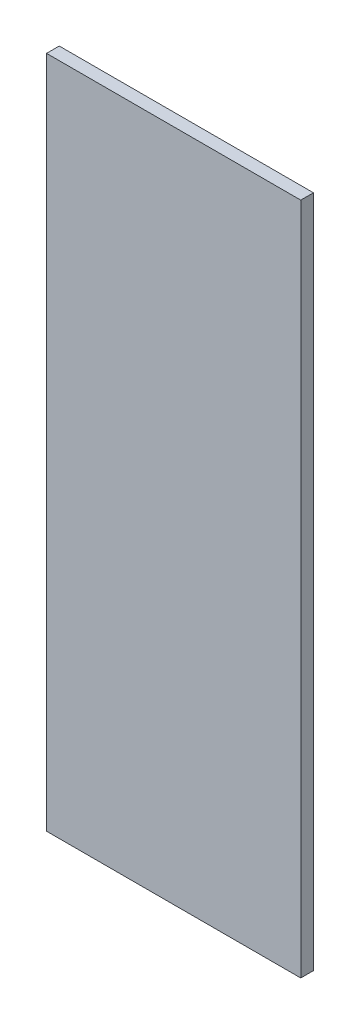
ISO-10303-21;
HEADER;
FILE_DESCRIPTION(('STEP AP214'),'2;1');
FILE_NAME('part.step','',(''),(''),'','','');
FILE_SCHEMA(('AUTOMOTIVE_DESIGN { 1 0 10303 214 1 1 1 1 }'));
ENDSEC;
DATA;
#1=APPLICATION_CONTEXT('core data for automotive mechanical design processes');
#2=APPLICATION_PROTOCOL_DEFINITION('international standard','automotive_design',2000,#1);
#3=PRODUCT_CONTEXT('',#1,'mechanical');
#4=PRODUCT('Part','Part','',(#3));
#5=PRODUCT_RELATED_PRODUCT_CATEGORY('part','',(#4));
#6=PRODUCT_DEFINITION_FORMATION('','',#4);
#7=PRODUCT_DEFINITION_CONTEXT('part definition',#1,'design');
#8=PRODUCT_DEFINITION('design','',#6,#7);
#9=PRODUCT_DEFINITION_SHAPE('','',#8);
#10=(LENGTH_UNIT() NAMED_UNIT(*) SI_UNIT(.MILLI.,.METRE.));
#11=(NAMED_UNIT(*) PLANE_ANGLE_UNIT() SI_UNIT($,.RADIAN.));
#12=(NAMED_UNIT(*) SI_UNIT($,.STERADIAN.) SOLID_ANGLE_UNIT());
#13=UNCERTAINTY_MEASURE_WITH_UNIT(LENGTH_MEASURE(1.E-05),#10,'distance_accuracy_value','');
#14=(GEOMETRIC_REPRESENTATION_CONTEXT(3) GLOBAL_UNCERTAINTY_ASSIGNED_CONTEXT((#13)) GLOBAL_UNIT_ASSIGNED_CONTEXT((#10,
#11,#12)) REPRESENTATION_CONTEXT('',''));
#15=CARTESIAN_POINT('',(0.,0.,0.));
#16=DIRECTION('',(0.,0.,1.));
#17=DIRECTION('',(1.,0.,0.));
#18=AXIS2_PLACEMENT_3D('',#15,#16,#17);
#19=CARTESIAN_POINT('',(0.,0.,4.));
#20=DIRECTION('',(1.,0.,0.));
#21=DIRECTION('',(0.,0.,-1.));
#22=AXIS2_PLACEMENT_3D('',#19,#20,#21);
#23=PLANE('',#22);
#24=DIRECTION('',(0.,-1.,0.));
#25=VECTOR('',#24,1.);
#26=CARTESIAN_POINT('',(0.,0.,0.));
#27=LINE('',#26,#25);
#28=CARTESIAN_POINT('',(0.,212.,0.));
#29=VERTEX_POINT('',#28);
#30=CARTESIAN_POINT('',(0.,0.,0.));
#31=VERTEX_POINT('',#30);
#32=EDGE_CURVE('E113',#29,#31,#27,.T.);
#33=ORIENTED_EDGE('',*,*,#32,.T.);
#34=DIRECTION('',(0.,0.,-1.));
#35=VECTOR('',#34,1.);
#36=CARTESIAN_POINT('',(0.,0.,4.));
#37=LINE('',#36,#35);
#38=CARTESIAN_POINT('',(0.,0.,4.));
#39=VERTEX_POINT('',#38);
#40=EDGE_CURVE('E11',#39,#31,#37,.T.);
#41=ORIENTED_EDGE('',*,*,#40,.F.);
#42=DIRECTION('',(0.,-1.,0.));
#43=VECTOR('',#42,1.);
#44=CARTESIAN_POINT('',(0.,0.,4.));
#45=LINE('',#44,#43);
#46=CARTESIAN_POINT('',(0.,212.,4.));
#47=VERTEX_POINT('',#46);
#48=EDGE_CURVE('E97',#47,#39,#45,.T.);
#49=ORIENTED_EDGE('',*,*,#48,.F.);
#50=DIRECTION('',(0.,0.,-1.));
#51=VECTOR('',#50,1.);
#52=CARTESIAN_POINT('',(0.,212.,4.));
#53=LINE('',#52,#51);
#54=EDGE_CURVE('E109',#47,#29,#53,.T.);
#55=ORIENTED_EDGE('',*,*,#54,.T.);
#56=EDGE_LOOP('',(#33,#41,#49,#55));
#57=FACE_BOUND('',#56,.T.);
#58=ADVANCED_FACE('F45',(#57),#23,.F.);
#59=CARTESIAN_POINT('',(0.,0.,4.));
#60=DIRECTION('',(0.,1.,0.));
#61=DIRECTION('',(0.,0.,1.));
#62=AXIS2_PLACEMENT_3D('',#59,#60,#61);
#63=PLANE('',#62);
#64=DIRECTION('',(1.,0.,0.));
#65=VECTOR('',#64,1.);
#66=CARTESIAN_POINT('',(0.,0.,0.));
#67=LINE('',#66,#65);
#68=CARTESIAN_POINT('',(80.,0.,0.));
#69=VERTEX_POINT('',#68);
#70=EDGE_CURVE('E102',#31,#69,#67,.T.);
#71=ORIENTED_EDGE('',*,*,#70,.T.);
#72=DIRECTION('',(0.,0.,-1.));
#73=VECTOR('',#72,1.);
#74=CARTESIAN_POINT('',(80.,0.,4.));
#75=LINE('',#74,#73);
#76=CARTESIAN_POINT('',(80.,0.,4.));
#77=VERTEX_POINT('',#76);
#78=EDGE_CURVE('E54',#77,#69,#75,.T.);
#79=ORIENTED_EDGE('',*,*,#78,.F.);
#80=DIRECTION('',(1.,0.,0.));
#81=VECTOR('',#80,1.);
#82=CARTESIAN_POINT('',(0.,0.,4.));
#83=LINE('',#82,#81);
#84=EDGE_CURVE('E92',#39,#77,#83,.T.);
#85=ORIENTED_EDGE('',*,*,#84,.F.);
#86=ORIENTED_EDGE('',*,*,#40,.T.);
#87=EDGE_LOOP('',(#71,#79,#85,#86));
#88=FACE_BOUND('',#87,.T.);
#89=ADVANCED_FACE('F101',(#88),#63,.F.);
#90=CARTESIAN_POINT('',(80.,0.,4.));
#91=DIRECTION('',(-1.,0.,0.));
#92=DIRECTION('',(0.,0.,1.));
#93=AXIS2_PLACEMENT_3D('',#90,#91,#92);
#94=PLANE('',#93);
#95=DIRECTION('',(0.,1.,0.));
#96=VECTOR('',#95,1.);
#97=CARTESIAN_POINT('',(80.,0.,0.));
#98=LINE('',#97,#96);
#99=CARTESIAN_POINT('',(80.,212.,0.));
#100=VERTEX_POINT('',#99);
#101=EDGE_CURVE('E79',#69,#100,#98,.T.);
#102=ORIENTED_EDGE('',*,*,#101,.T.);
#103=DIRECTION('',(0.,0.,-1.));
#104=VECTOR('',#103,1.);
#105=CARTESIAN_POINT('',(80.,212.,4.));
#106=LINE('',#105,#104);
#107=CARTESIAN_POINT('',(80.,212.,4.));
#108=VERTEX_POINT('',#107);
#109=EDGE_CURVE('E104',#108,#100,#106,.T.);
#110=ORIENTED_EDGE('',*,*,#109,.F.);
#111=DIRECTION('',(0.,1.,0.));
#112=VECTOR('',#111,1.);
#113=CARTESIAN_POINT('',(80.,0.,4.));
#114=LINE('',#113,#112);
#115=EDGE_CURVE('E95',#77,#108,#114,.T.);
#116=ORIENTED_EDGE('',*,*,#115,.F.);
#117=ORIENTED_EDGE('',*,*,#78,.T.);
#118=EDGE_LOOP('',(#102,#110,#116,#117));
#119=FACE_BOUND('',#118,.T.);
#120=ADVANCED_FACE('F105',(#119),#94,.F.);
#121=CARTESIAN_POINT('',(0.,212.,4.));
#122=DIRECTION('',(0.,-1.,0.));
#123=DIRECTION('',(0.,0.,-1.));
#124=AXIS2_PLACEMENT_3D('',#121,#122,#123);
#125=PLANE('',#124);
#126=DIRECTION('',(-1.,0.,0.));
#127=VECTOR('',#126,1.);
#128=CARTESIAN_POINT('',(0.,212.,0.));
#129=LINE('',#128,#127);
#130=EDGE_CURVE('E85',#100,#29,#129,.T.);
#131=ORIENTED_EDGE('',*,*,#130,.T.);
#132=ORIENTED_EDGE('',*,*,#54,.F.);
#133=DIRECTION('',(-1.,0.,0.));
#134=VECTOR('',#133,1.);
#135=CARTESIAN_POINT('',(0.,212.,4.));
#136=LINE('',#135,#134);
#137=EDGE_CURVE('E62',#108,#47,#136,.T.);
#138=ORIENTED_EDGE('',*,*,#137,.F.);
#139=ORIENTED_EDGE('',*,*,#109,.T.);
#140=EDGE_LOOP('',(#131,#132,#138,#139));
#141=FACE_BOUND('',#140,.T.);
#142=ADVANCED_FACE('F126',(#141),#125,.F.);
#143=CARTESIAN_POINT('',(0.,0.,4.));
#144=DIRECTION('',(0.,0.,-1.));
#145=DIRECTION('',(-1.,0.,0.));
#146=AXIS2_PLACEMENT_3D('',#143,#144,#145);
#147=PLANE('',#146);
#148=ORIENTED_EDGE('',*,*,#48,.T.);
#149=ORIENTED_EDGE('',*,*,#84,.T.);
#150=ORIENTED_EDGE('',*,*,#115,.T.);
#151=ORIENTED_EDGE('',*,*,#137,.T.);
#152=EDGE_LOOP('',(#148,#149,#150,#151));
#153=FACE_BOUND('',#152,.T.);
#154=ADVANCED_FACE('F93',(#153),#147,.F.);
#155=CARTESIAN_POINT('',(0.,0.,0.));
#156=DIRECTION('',(0.,0.,-1.));
#157=DIRECTION('',(-1.,0.,0.));
#158=AXIS2_PLACEMENT_3D('',#155,#156,#157);
#159=PLANE('',#158);
#160=ORIENTED_EDGE('',*,*,#32,.F.);
#161=ORIENTED_EDGE('',*,*,#130,.F.);
#162=ORIENTED_EDGE('',*,*,#101,.F.);
#163=ORIENTED_EDGE('',*,*,#70,.F.);
#164=EDGE_LOOP('',(#160,#161,#162,#163));
#165=FACE_BOUND('',#164,.T.);
#166=ADVANCED_FACE('F129',(#165),#159,.T.);
#167=CLOSED_SHELL('',(#58,#89,#120,#142,#154,#166));
#168=MANIFOLD_SOLID_BREP('B2',#167);
#169=ADVANCED_BREP_SHAPE_REPRESENTATION('',(#18,#168),#14);
#170=SHAPE_DEFINITION_REPRESENTATION(#9,#169);
ENDSEC;
END-ISO-10303-21;
